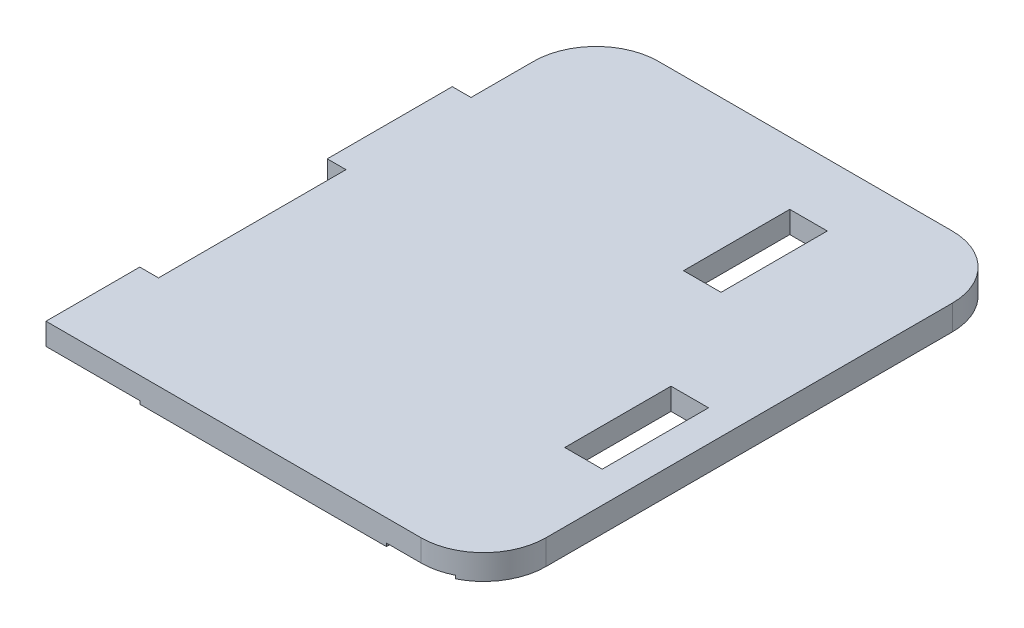
ISO-10303-21;
HEADER;
FILE_DESCRIPTION(('STEP AP214'),'2;1');
FILE_NAME('part.step','',(''),(''),'','','');
FILE_SCHEMA(('AUTOMOTIVE_DESIGN { 1 0 10303 214 1 1 1 1 }'));
ENDSEC;
DATA;
#1=APPLICATION_CONTEXT('core data for automotive mechanical design processes');
#2=APPLICATION_PROTOCOL_DEFINITION('international standard','automotive_design',2000,#1);
#3=PRODUCT_CONTEXT('',#1,'mechanical');
#4=PRODUCT('Part','Part','',(#3));
#5=PRODUCT_RELATED_PRODUCT_CATEGORY('part','',(#4));
#6=PRODUCT_DEFINITION_FORMATION('','',#4);
#7=PRODUCT_DEFINITION_CONTEXT('part definition',#1,'design');
#8=PRODUCT_DEFINITION('design','',#6,#7);
#9=PRODUCT_DEFINITION_SHAPE('','',#8);
#10=(LENGTH_UNIT() NAMED_UNIT(*) SI_UNIT(.MILLI.,.METRE.));
#11=(NAMED_UNIT(*) PLANE_ANGLE_UNIT() SI_UNIT($,.RADIAN.));
#12=(NAMED_UNIT(*) SI_UNIT($,.STERADIAN.) SOLID_ANGLE_UNIT());
#13=UNCERTAINTY_MEASURE_WITH_UNIT(LENGTH_MEASURE(1.E-05),#10,'distance_accuracy_value','');
#14=(GEOMETRIC_REPRESENTATION_CONTEXT(3) GLOBAL_UNCERTAINTY_ASSIGNED_CONTEXT((#13)) GLOBAL_UNIT_ASSIGNED_CONTEXT((#10,
#11,#12)) REPRESENTATION_CONTEXT('',''));
#15=CARTESIAN_POINT('',(0.,0.,0.));
#16=DIRECTION('',(0.,0.,1.));
#17=DIRECTION('',(1.,0.,0.));
#18=AXIS2_PLACEMENT_3D('',#15,#16,#17);
#19=CARTESIAN_POINT('',(0.,0.,0.));
#20=DIRECTION('',(0.,1.,0.));
#21=DIRECTION('',(0.,0.,1.));
#22=AXIS2_PLACEMENT_3D('',#19,#20,#21);
#23=PLANE('',#22);
#24=CARTESIAN_POINT('',(6.,0.,-1.));
#25=DIRECTION('',(0.,1.,0.));
#26=DIRECTION('',(0.,0.,1.));
#27=AXIS2_PLACEMENT_3D('',#24,#25,#26);
#28=CIRCLE('',#27,1.);
#29=CARTESIAN_POINT('',(7.,0.,-1.));
#30=VERTEX_POINT('',#29);
#31=CARTESIAN_POINT('',(6.448166537674,0.,-0.106049914978863));
#32=VERTEX_POINT('',#31);
#33=EDGE_CURVE('E468',#30,#32,#28,.F.);
#34=ORIENTED_EDGE('',*,*,#33,.T.);
#35=DIRECTION('',(0.,0.,1.));
#36=VECTOR('',#35,1.);
#37=CARTESIAN_POINT('',(6.448166537674,0.,-2.4));
#38=LINE('',#37,#36);
#39=CARTESIAN_POINT('',(6.448166537674,0.,-2.4));
#40=VERTEX_POINT('',#39);
#41=EDGE_CURVE('E494',#40,#32,#38,.T.);
#42=ORIENTED_EDGE('',*,*,#41,.F.);
#43=DIRECTION('',(1.,0.,0.));
#44=VECTOR('',#43,1.);
#45=CARTESIAN_POINT('',(5.9,0.,-2.4));
#46=LINE('',#45,#44);
#47=CARTESIAN_POINT('',(6.5,0.,-2.4));
#48=VERTEX_POINT('',#47);
#49=EDGE_CURVE('E352',#40,#48,#46,.T.);
#50=ORIENTED_EDGE('',*,*,#49,.T.);
#51=DIRECTION('',(0.,0.,-1.));
#52=VECTOR('',#51,1.);
#53=CARTESIAN_POINT('',(6.5,0.,-2.4));
#54=LINE('',#53,#52);
#55=CARTESIAN_POINT('',(6.5,0.,-4.1));
#56=VERTEX_POINT('',#55);
#57=EDGE_CURVE('E365',#48,#56,#54,.T.);
#58=ORIENTED_EDGE('',*,*,#57,.T.);
#59=DIRECTION('',(-1.,0.,0.));
#60=VECTOR('',#59,1.);
#61=CARTESIAN_POINT('',(5.9,0.,-4.1));
#62=LINE('',#61,#60);
#63=CARTESIAN_POINT('',(6.448166537674,0.,-4.1));
#64=VERTEX_POINT('',#63);
#65=EDGE_CURVE('E356',#56,#64,#62,.T.);
#66=ORIENTED_EDGE('',*,*,#65,.T.);
#67=CARTESIAN_POINT('',(6.448166537674,0.,-5.1));
#68=VERTEX_POINT('',#67);
#69=EDGE_CURVE('E552',#68,#64,#38,.T.);
#70=ORIENTED_EDGE('',*,*,#69,.F.);
#71=CARTESIAN_POINT('',(5.9,0.,-5.1));
#72=DIRECTION('',(0.,-1.,0.));
#73=DIRECTION('',(0.,0.,-1.));
#74=AXIS2_PLACEMENT_3D('',#71,#72,#73);
#75=CIRCLE('',#74,0.548166537674001);
#76=CARTESIAN_POINT('',(5.97920351117561,0.,-5.64241437743017));
#77=VERTEX_POINT('',#76);
#78=EDGE_CURVE('E549',#77,#68,#75,.T.);
#79=ORIENTED_EDGE('',*,*,#78,.F.);
#80=DIRECTION('',(0.989506546188972,0.,0.144488044658277));
#81=VECTOR('',#80,1.);
#82=CARTESIAN_POINT('',(5.97920351117561,0.,-5.64241437743017));
#83=LINE('',#82,#81);
#84=CARTESIAN_POINT('',(4.9,0.,-5.8));
#85=VERTEX_POINT('',#84);
#86=EDGE_CURVE('E546',#85,#77,#83,.T.);
#87=ORIENTED_EDGE('',*,*,#86,.F.);
#88=DIRECTION('',(1.,0.,0.));
#89=VECTOR('',#88,1.);
#90=CARTESIAN_POINT('',(4.4,0.,-5.8));
#91=LINE('',#90,#89);
#92=CARTESIAN_POINT('',(5.,0.,-5.8));
#93=VERTEX_POINT('',#92);
#94=EDGE_CURVE('E380',#85,#93,#91,.T.);
#95=ORIENTED_EDGE('',*,*,#94,.T.);
#96=DIRECTION('',(0.,0.,-1.));
#97=VECTOR('',#96,1.);
#98=CARTESIAN_POINT('',(5.,0.,-7.5));
#99=LINE('',#98,#97);
#100=CARTESIAN_POINT('',(5.,0.,-7.5));
#101=VERTEX_POINT('',#100);
#102=EDGE_CURVE('E393',#93,#101,#99,.T.);
#103=ORIENTED_EDGE('',*,*,#102,.T.);
#104=DIRECTION('',(-1.,0.,0.));
#105=VECTOR('',#104,1.);
#106=CARTESIAN_POINT('',(4.4,0.,-7.5));
#107=LINE('',#106,#105);
#108=CARTESIAN_POINT('',(4.9,0.,-7.5));
#109=VERTEX_POINT('',#108);
#110=EDGE_CURVE('E384',#101,#109,#107,.T.);
#111=ORIENTED_EDGE('',*,*,#110,.T.);
#112=DIRECTION('',(0.,0.,1.));
#113=VECTOR('',#112,1.);
#114=CARTESIAN_POINT('',(4.9,0.,-5.8));
#115=LINE('',#114,#113);
#116=CARTESIAN_POINT('',(4.9,0.,-8.5));
#117=VERTEX_POINT('',#116);
#118=EDGE_CURVE('E544',#117,#109,#115,.T.);
#119=ORIENTED_EDGE('',*,*,#118,.F.);
#120=DIRECTION('',(-1.,0.,0.));
#121=VECTOR('',#120,1.);
#122=CARTESIAN_POINT('',(7.,0.,-8.5));
#123=LINE('',#122,#121);
#124=CARTESIAN_POINT('',(6.,0.,-8.5));
#125=VERTEX_POINT('',#124);
#126=EDGE_CURVE('E412',#125,#117,#123,.T.);
#127=ORIENTED_EDGE('',*,*,#126,.F.);
#128=CARTESIAN_POINT('',(6.,0.,-7.5));
#129=DIRECTION('',(0.,1.,0.));
#130=DIRECTION('',(0.,0.,1.));
#131=AXIS2_PLACEMENT_3D('',#128,#129,#130);
#132=CIRCLE('',#131,1.);
#133=CARTESIAN_POINT('',(7.,0.,-7.5));
#134=VERTEX_POINT('',#133);
#135=EDGE_CURVE('E466',#125,#134,#132,.F.);
#136=ORIENTED_EDGE('',*,*,#135,.T.);
#137=DIRECTION('',(0.,0.,-1.));
#138=VECTOR('',#137,1.);
#139=CARTESIAN_POINT('',(7.,0.,0.));
#140=LINE('',#139,#138);
#141=EDGE_CURVE('E435',#30,#134,#140,.T.);
#142=ORIENTED_EDGE('',*,*,#141,.F.);
#143=EDGE_LOOP('',(#34,#42,#50,#58,#66,#70,#79,#87,#95,#103,#111,#119,#127,#136,#142));
#144=FACE_BOUND('',#143,.T.);
#145=ADVANCED_FACE('F35',(#144),#23,.F.);
#146=CARTESIAN_POINT('',(0.,0.4,-1.5));
#147=DIRECTION('',(1.,0.,0.));
#148=DIRECTION('',(0.,0.,-1.));
#149=AXIS2_PLACEMENT_3D('',#146,#147,#148);
#150=PLANE('',#149);
#151=DIRECTION('',(0.,0.,-1.));
#152=VECTOR('',#151,1.);
#153=CARTESIAN_POINT('',(0.,0.05,-8.5));
#154=LINE('',#153,#152);
#155=CARTESIAN_POINT('',(0.,0.05,0.));
#156=VERTEX_POINT('',#155);
#157=CARTESIAN_POINT('',(0.,0.05,-1.5));
#158=VERTEX_POINT('',#157);
#159=EDGE_CURVE('E308',#156,#158,#154,.T.);
#160=ORIENTED_EDGE('',*,*,#159,.F.);
#161=DIRECTION('',(0.,-1.,0.));
#162=VECTOR('',#161,1.);
#163=CARTESIAN_POINT('',(0.,0.4,0.));
#164=LINE('',#163,#162);
#165=CARTESIAN_POINT('',(0.,0.4,0.));
#166=VERTEX_POINT('',#165);
#167=EDGE_CURVE('E458',#166,#156,#164,.T.);
#168=ORIENTED_EDGE('',*,*,#167,.F.);
#169=DIRECTION('',(0.,0.,1.));
#170=VECTOR('',#169,1.);
#171=CARTESIAN_POINT('',(0.,0.4,-1.5));
#172=LINE('',#171,#170);
#173=CARTESIAN_POINT('',(0.,0.4,-1.5));
#174=VERTEX_POINT('',#173);
#175=EDGE_CURVE('E408',#174,#166,#172,.T.);
#176=ORIENTED_EDGE('',*,*,#175,.F.);
#177=DIRECTION('',(0.,-1.,0.));
#178=VECTOR('',#177,1.);
#179=CARTESIAN_POINT('',(0.,0.4,-1.5));
#180=LINE('',#179,#178);
#181=EDGE_CURVE('E433',#174,#158,#180,.T.);
#182=ORIENTED_EDGE('',*,*,#181,.T.);
#183=EDGE_LOOP('',(#160,#168,#176,#182));
#184=FACE_BOUND('',#183,.T.);
#185=ADVANCED_FACE('F509',(#184),#150,.F.);
#186=CARTESIAN_POINT('',(0.299999999999999,0.4,-8.5));
#187=DIRECTION('',(1.,0.,0.));
#188=DIRECTION('',(0.,0.,-1.));
#189=AXIS2_PLACEMENT_3D('',#186,#187,#188);
#190=PLANE('',#189);
#191=DIRECTION('',(0.,0.,-1.));
#192=VECTOR('',#191,1.);
#193=CARTESIAN_POINT('',(0.299999999999999,0.05,-8.5));
#194=LINE('',#193,#192);
#195=CARTESIAN_POINT('',(0.299999999999999,0.05,-6.5));
#196=VERTEX_POINT('',#195);
#197=CARTESIAN_POINT('',(0.299999999999999,0.05,-7.5));
#198=VERTEX_POINT('',#197);
#199=EDGE_CURVE('E58',#196,#198,#194,.T.);
#200=ORIENTED_EDGE('',*,*,#199,.F.);
#201=DIRECTION('',(0.,-1.,0.));
#202=VECTOR('',#201,1.);
#203=CARTESIAN_POINT('',(0.299999999999999,0.4,-6.5));
#204=LINE('',#203,#202);
#205=CARTESIAN_POINT('',(0.299999999999999,0.4,-6.5));
#206=VERTEX_POINT('',#205);
#207=EDGE_CURVE('E455',#206,#196,#204,.T.);
#208=ORIENTED_EDGE('',*,*,#207,.F.);
#209=DIRECTION('',(0.,0.,1.));
#210=VECTOR('',#209,1.);
#211=CARTESIAN_POINT('',(0.299999999999999,0.4,-8.5));
#212=LINE('',#211,#210);
#213=CARTESIAN_POINT('',(0.299999999999999,0.4,-7.5));
#214=VERTEX_POINT('',#213);
#215=EDGE_CURVE('E421',#214,#206,#212,.T.);
#216=ORIENTED_EDGE('',*,*,#215,.F.);
#217=DIRECTION('',(0.,-1.,0.));
#218=VECTOR('',#217,1.);
#219=CARTESIAN_POINT('',(0.299999999999999,0.4,-7.5));
#220=LINE('',#219,#218);
#221=EDGE_CURVE('E484',#214,#198,#220,.T.);
#222=ORIENTED_EDGE('',*,*,#221,.T.);
#223=EDGE_LOOP('',(#200,#208,#216,#222));
#224=FACE_BOUND('',#223,.T.);
#225=ADVANCED_FACE('F661',(#224),#190,.F.);
#226=CARTESIAN_POINT('',(0.299999999999999,0.4,-6.5));
#227=DIRECTION('',(0.,0.,1.));
#228=DIRECTION('',(1.,0.,0.));
#229=AXIS2_PLACEMENT_3D('',#226,#227,#228);
#230=PLANE('',#229);
#231=DIRECTION('',(1.,0.,0.));
#232=VECTOR('',#231,1.);
#233=CARTESIAN_POINT('',(0.299999999999999,0.05,-6.5));
#234=LINE('',#233,#232);
#235=CARTESIAN_POINT('',(0.,0.05,-6.5));
#236=VERTEX_POINT('',#235);
#237=EDGE_CURVE('E319',#236,#196,#234,.T.);
#238=ORIENTED_EDGE('',*,*,#237,.F.);
#239=DIRECTION('',(0.,-1.,0.));
#240=VECTOR('',#239,1.);
#241=CARTESIAN_POINT('',(0.,0.4,-6.5));
#242=LINE('',#241,#240);
#243=CARTESIAN_POINT('',(0.,0.4,-6.5));
#244=VERTEX_POINT('',#243);
#245=EDGE_CURVE('E452',#244,#236,#242,.T.);
#246=ORIENTED_EDGE('',*,*,#245,.F.);
#247=DIRECTION('',(-1.,0.,0.));
#248=VECTOR('',#247,1.);
#249=CARTESIAN_POINT('',(0.299999999999999,0.4,-6.5));
#250=LINE('',#249,#248);
#251=EDGE_CURVE('E423',#206,#244,#250,.T.);
#252=ORIENTED_EDGE('',*,*,#251,.F.);
#253=ORIENTED_EDGE('',*,*,#207,.T.);
#254=EDGE_LOOP('',(#238,#246,#252,#253));
#255=FACE_BOUND('',#254,.T.);
#256=ADVANCED_FACE('F698',(#255),#230,.F.);
#257=CARTESIAN_POINT('',(0.,0.4,-6.5));
#258=DIRECTION('',(1.,0.,0.));
#259=DIRECTION('',(0.,0.,-1.));
#260=AXIS2_PLACEMENT_3D('',#257,#258,#259);
#261=PLANE('',#260);
#262=CARTESIAN_POINT('',(0.,0.05,-4.5));
#263=VERTEX_POINT('',#262);
#264=EDGE_CURVE('E307',#263,#236,#154,.T.);
#265=ORIENTED_EDGE('',*,*,#264,.F.);
#266=DIRECTION('',(0.,-1.,0.));
#267=VECTOR('',#266,1.);
#268=CARTESIAN_POINT('',(0.,0.4,-4.5));
#269=LINE('',#268,#267);
#270=CARTESIAN_POINT('',(0.,0.4,-4.5));
#271=VERTEX_POINT('',#270);
#272=EDGE_CURVE('E449',#271,#263,#269,.T.);
#273=ORIENTED_EDGE('',*,*,#272,.F.);
#274=DIRECTION('',(0.,0.,1.));
#275=VECTOR('',#274,1.);
#276=CARTESIAN_POINT('',(0.,0.4,-6.5));
#277=LINE('',#276,#275);
#278=EDGE_CURVE('E425',#244,#271,#277,.T.);
#279=ORIENTED_EDGE('',*,*,#278,.F.);
#280=ORIENTED_EDGE('',*,*,#245,.T.);
#281=EDGE_LOOP('',(#265,#273,#279,#280));
#282=FACE_BOUND('',#281,.T.);
#283=ADVANCED_FACE('F694',(#282),#261,.F.);
#284=CARTESIAN_POINT('',(0.,0.4,-4.5));
#285=DIRECTION('',(0.,0.,-1.));
#286=DIRECTION('',(-1.,0.,0.));
#287=AXIS2_PLACEMENT_3D('',#284,#285,#286);
#288=PLANE('',#287);
#289=DIRECTION('',(-1.,0.,0.));
#290=VECTOR('',#289,1.);
#291=CARTESIAN_POINT('',(0.,0.05,-4.5));
#292=LINE('',#291,#290);
#293=CARTESIAN_POINT('',(0.3,0.05,-4.5));
#294=VERTEX_POINT('',#293);
#295=EDGE_CURVE('E326',#294,#263,#292,.T.);
#296=ORIENTED_EDGE('',*,*,#295,.F.);
#297=DIRECTION('',(0.,-1.,0.));
#298=VECTOR('',#297,1.);
#299=CARTESIAN_POINT('',(0.3,0.4,-4.5));
#300=LINE('',#299,#298);
#301=CARTESIAN_POINT('',(0.3,0.4,-4.5));
#302=VERTEX_POINT('',#301);
#303=EDGE_CURVE('E446',#302,#294,#300,.T.);
#304=ORIENTED_EDGE('',*,*,#303,.F.);
#305=DIRECTION('',(1.,0.,0.));
#306=VECTOR('',#305,1.);
#307=CARTESIAN_POINT('',(0.,0.4,-4.5));
#308=LINE('',#307,#306);
#309=EDGE_CURVE('E427',#271,#302,#308,.T.);
#310=ORIENTED_EDGE('',*,*,#309,.F.);
#311=ORIENTED_EDGE('',*,*,#272,.T.);
#312=EDGE_LOOP('',(#296,#304,#310,#311));
#313=FACE_BOUND('',#312,.T.);
#314=ADVANCED_FACE('F688',(#313),#288,.F.);
#315=CARTESIAN_POINT('',(0.3,0.4,-4.5));
#316=DIRECTION('',(1.,0.,0.));
#317=DIRECTION('',(0.,0.,-1.));
#318=AXIS2_PLACEMENT_3D('',#315,#316,#317);
#319=PLANE('',#318);
#320=DIRECTION('',(0.,0.,-1.));
#321=VECTOR('',#320,1.);
#322=CARTESIAN_POINT('',(0.3,0.05,-4.5));
#323=LINE('',#322,#321);
#324=CARTESIAN_POINT('',(0.3,0.05,-1.5));
#325=VERTEX_POINT('',#324);
#326=EDGE_CURVE('E324',#325,#294,#323,.T.);
#327=ORIENTED_EDGE('',*,*,#326,.F.);
#328=DIRECTION('',(0.,-1.,0.));
#329=VECTOR('',#328,1.);
#330=CARTESIAN_POINT('',(0.3,0.4,-1.5));
#331=LINE('',#330,#329);
#332=CARTESIAN_POINT('',(0.3,0.4,-1.5));
#333=VERTEX_POINT('',#332);
#334=EDGE_CURVE('E443',#333,#325,#331,.T.);
#335=ORIENTED_EDGE('',*,*,#334,.F.);
#336=DIRECTION('',(0.,0.,1.));
#337=VECTOR('',#336,1.);
#338=CARTESIAN_POINT('',(0.3,0.4,-4.5));
#339=LINE('',#338,#337);
#340=EDGE_CURVE('E429',#302,#333,#339,.T.);
#341=ORIENTED_EDGE('',*,*,#340,.F.);
#342=ORIENTED_EDGE('',*,*,#303,.T.);
#343=EDGE_LOOP('',(#327,#335,#341,#342));
#344=FACE_BOUND('',#343,.T.);
#345=ADVANCED_FACE('F683',(#344),#319,.F.);
#346=CARTESIAN_POINT('',(0.3,0.4,-1.5));
#347=DIRECTION('',(0.,0.,1.));
#348=DIRECTION('',(1.,0.,0.));
#349=AXIS2_PLACEMENT_3D('',#346,#347,#348);
#350=PLANE('',#349);
#351=DIRECTION('',(1.,0.,0.));
#352=VECTOR('',#351,1.);
#353=CARTESIAN_POINT('',(0.3,0.05,-1.5));
#354=LINE('',#353,#352);
#355=EDGE_CURVE('E322',#158,#325,#354,.T.);
#356=ORIENTED_EDGE('',*,*,#355,.F.);
#357=ORIENTED_EDGE('',*,*,#181,.F.);
#358=DIRECTION('',(-1.,0.,0.));
#359=VECTOR('',#358,1.);
#360=CARTESIAN_POINT('',(0.3,0.4,-1.5));
#361=LINE('',#360,#359);
#362=EDGE_CURVE('E431',#333,#174,#361,.T.);
#363=ORIENTED_EDGE('',*,*,#362,.F.);
#364=ORIENTED_EDGE('',*,*,#334,.T.);
#365=EDGE_LOOP('',(#356,#357,#363,#364));
#366=FACE_BOUND('',#365,.T.);
#367=ADVANCED_FACE('F677',(#366),#350,.F.);
#368=CARTESIAN_POINT('',(4.4,0.4,-7.5));
#369=DIRECTION('',(1.,0.,0.));
#370=DIRECTION('',(0.,0.,-1.));
#371=AXIS2_PLACEMENT_3D('',#368,#369,#370);
#372=PLANE('',#371);
#373=DIRECTION('',(0.,-1.,0.));
#374=VECTOR('',#373,1.);
#375=CARTESIAN_POINT('',(4.4,0.4,-5.8));
#376=LINE('',#375,#374);
#377=CARTESIAN_POINT('',(4.4,0.4,-5.8));
#378=VERTEX_POINT('',#377);
#379=CARTESIAN_POINT('',(4.4,0.05,-5.8));
#380=VERTEX_POINT('',#379);
#381=EDGE_CURVE('E405',#378,#380,#376,.T.);
#382=ORIENTED_EDGE('',*,*,#381,.T.);
#383=DIRECTION('',(0.,0.,-1.));
#384=VECTOR('',#383,1.);
#385=CARTESIAN_POINT('',(4.4,0.05,-7.5));
#386=LINE('',#385,#384);
#387=CARTESIAN_POINT('',(4.4,0.05,-7.5));
#388=VERTEX_POINT('',#387);
#389=EDGE_CURVE('E340',#380,#388,#386,.T.);
#390=ORIENTED_EDGE('',*,*,#389,.T.);
#391=DIRECTION('',(0.,-1.,0.));
#392=VECTOR('',#391,1.);
#393=CARTESIAN_POINT('',(4.4,0.4,-7.5));
#394=LINE('',#393,#392);
#395=CARTESIAN_POINT('',(4.4,0.4,-7.5));
#396=VERTEX_POINT('',#395);
#397=EDGE_CURVE('E391',#396,#388,#394,.T.);
#398=ORIENTED_EDGE('',*,*,#397,.F.);
#399=DIRECTION('',(0.,0.,1.));
#400=VECTOR('',#399,1.);
#401=CARTESIAN_POINT('',(4.4,0.4,-7.5));
#402=LINE('',#401,#400);
#403=EDGE_CURVE('E381',#396,#378,#402,.T.);
#404=ORIENTED_EDGE('',*,*,#403,.T.);
#405=EDGE_LOOP('',(#382,#390,#398,#404));
#406=FACE_BOUND('',#405,.T.);
#407=ADVANCED_FACE('F641',(#406),#372,.T.);
#408=CARTESIAN_POINT('',(5.9,0.4,-2.4));
#409=DIRECTION('',(1.,0.,0.));
#410=DIRECTION('',(0.,0.,-1.));
#411=AXIS2_PLACEMENT_3D('',#408,#409,#410);
#412=PLANE('',#411);
#413=DIRECTION('',(0.,-1.,0.));
#414=VECTOR('',#413,1.);
#415=CARTESIAN_POINT('',(5.9,0.4,-2.4));
#416=LINE('',#415,#414);
#417=CARTESIAN_POINT('',(5.9,0.4,-2.4));
#418=VERTEX_POINT('',#417);
#419=CARTESIAN_POINT('',(5.9,0.05,-2.4));
#420=VERTEX_POINT('',#419);
#421=EDGE_CURVE('E377',#418,#420,#416,.T.);
#422=ORIENTED_EDGE('',*,*,#421,.T.);
#423=DIRECTION('',(0.,0.,-1.));
#424=VECTOR('',#423,1.);
#425=CARTESIAN_POINT('',(5.9,0.05,-2.4));
#426=LINE('',#425,#424);
#427=CARTESIAN_POINT('',(5.9,0.05,-4.1));
#428=VERTEX_POINT('',#427);
#429=EDGE_CURVE('E331',#420,#428,#426,.T.);
#430=ORIENTED_EDGE('',*,*,#429,.T.);
#431=DIRECTION('',(0.,-1.,0.));
#432=VECTOR('',#431,1.);
#433=CARTESIAN_POINT('',(5.9,0.4,-4.1));
#434=LINE('',#433,#432);
#435=CARTESIAN_POINT('',(5.9,0.4,-4.1));
#436=VERTEX_POINT('',#435);
#437=EDGE_CURVE('E363',#436,#428,#434,.T.);
#438=ORIENTED_EDGE('',*,*,#437,.F.);
#439=DIRECTION('',(0.,0.,1.));
#440=VECTOR('',#439,1.);
#441=CARTESIAN_POINT('',(5.9,0.4,-2.4));
#442=LINE('',#441,#440);
#443=EDGE_CURVE('E353',#436,#418,#442,.T.);
#444=ORIENTED_EDGE('',*,*,#443,.T.);
#445=EDGE_LOOP('',(#422,#430,#438,#444));
#446=FACE_BOUND('',#445,.T.);
#447=ADVANCED_FACE('F608',(#446),#412,.T.);
#448=CARTESIAN_POINT('',(1.3,0.4,-7.5));
#449=DIRECTION('',(0.,-1.,0.));
#450=DIRECTION('',(0.,0.,-1.));
#451=AXIS2_PLACEMENT_3D('',#448,#449,#450);
#452=CYLINDRICAL_SURFACE('',#451,1.);
#453=DIRECTION('',(0.,-1.,0.));
#454=VECTOR('',#453,1.);
#455=CARTESIAN_POINT('',(1.3,0.4,-8.5));
#456=LINE('',#455,#454);
#457=CARTESIAN_POINT('',(1.3,0.05,-8.5));
#458=VERTEX_POINT('',#457);
#459=CARTESIAN_POINT('',(1.3,0.4,-8.5));
#460=VERTEX_POINT('',#459);
#461=EDGE_CURVE('E479',#458,#460,#456,.F.);
#462=ORIENTED_EDGE('',*,*,#461,.F.);
#463=CARTESIAN_POINT('',(1.3,0.05,-7.5));
#464=DIRECTION('',(0.,-1.,0.));
#465=DIRECTION('',(0.,0.,-1.));
#466=AXIS2_PLACEMENT_3D('',#463,#464,#465);
#467=CIRCLE('',#466,1.);
#468=EDGE_CURVE('E487',#458,#198,#467,.F.);
#469=ORIENTED_EDGE('',*,*,#468,.T.);
#470=ORIENTED_EDGE('',*,*,#221,.F.);
#471=CARTESIAN_POINT('',(1.3,0.4,-7.5));
#472=DIRECTION('',(0.,1.,0.));
#473=DIRECTION('',(0.,0.,1.));
#474=AXIS2_PLACEMENT_3D('',#471,#472,#473);
#475=CIRCLE('',#474,1.);
#476=EDGE_CURVE('E473',#460,#214,#475,.T.);
#477=ORIENTED_EDGE('',*,*,#476,.F.);
#478=EDGE_LOOP('',(#462,#469,#470,#477));
#479=FACE_BOUND('',#478,.T.);
#480=ADVANCED_FACE('F37',(#479),#452,.T.);
#481=CARTESIAN_POINT('',(0.,0.4,0.));
#482=DIRECTION('',(0.,1.,0.));
#483=DIRECTION('',(0.,0.,1.));
#484=AXIS2_PLACEMENT_3D('',#481,#482,#483);
#485=PLANE('',#484);
#486=DIRECTION('',(1.,0.,0.));
#487=VECTOR('',#486,1.);
#488=CARTESIAN_POINT('',(0.,0.4,0.));
#489=LINE('',#488,#487);
#490=CARTESIAN_POINT('',(6.,0.4,0.));
#491=VERTEX_POINT('',#490);
#492=EDGE_CURVE('E411',#166,#491,#489,.T.);
#493=ORIENTED_EDGE('',*,*,#492,.T.);
#494=CARTESIAN_POINT('',(6.,0.4,-1.));
#495=DIRECTION('',(0.,1.,0.));
#496=DIRECTION('',(0.,0.,1.));
#497=AXIS2_PLACEMENT_3D('',#494,#495,#496);
#498=CIRCLE('',#497,1.);
#499=CARTESIAN_POINT('',(7.,0.4,-1.));
#500=VERTEX_POINT('',#499);
#501=EDGE_CURVE('E477',#491,#500,#498,.T.);
#502=ORIENTED_EDGE('',*,*,#501,.T.);
#503=DIRECTION('',(0.,0.,-1.));
#504=VECTOR('',#503,1.);
#505=CARTESIAN_POINT('',(7.,0.4,0.));
#506=LINE('',#505,#504);
#507=CARTESIAN_POINT('',(7.,0.4,-7.5));
#508=VERTEX_POINT('',#507);
#509=EDGE_CURVE('E415',#500,#508,#506,.T.);
#510=ORIENTED_EDGE('',*,*,#509,.T.);
#511=CARTESIAN_POINT('',(6.,0.4,-7.5));
#512=DIRECTION('',(0.,1.,0.));
#513=DIRECTION('',(0.,0.,1.));
#514=AXIS2_PLACEMENT_3D('',#511,#512,#513);
#515=CIRCLE('',#514,1.);
#516=CARTESIAN_POINT('',(6.,0.4,-8.5));
#517=VERTEX_POINT('',#516);
#518=EDGE_CURVE('E475',#508,#517,#515,.T.);
#519=ORIENTED_EDGE('',*,*,#518,.T.);
#520=DIRECTION('',(-1.,0.,0.));
#521=VECTOR('',#520,1.);
#522=CARTESIAN_POINT('',(7.,0.4,-8.5));
#523=LINE('',#522,#521);
#524=EDGE_CURVE('E418',#517,#460,#523,.T.);
#525=ORIENTED_EDGE('',*,*,#524,.T.);
#526=ORIENTED_EDGE('',*,*,#476,.T.);
#527=ORIENTED_EDGE('',*,*,#215,.T.);
#528=ORIENTED_EDGE('',*,*,#251,.T.);
#529=ORIENTED_EDGE('',*,*,#278,.T.);
#530=ORIENTED_EDGE('',*,*,#309,.T.);
#531=ORIENTED_EDGE('',*,*,#340,.T.);
#532=ORIENTED_EDGE('',*,*,#362,.T.);
#533=ORIENTED_EDGE('',*,*,#175,.T.);
#534=EDGE_LOOP('',(#493,#502,#510,#519,#525,#526,#527,#528,#529,#530,#531,#532,#533));
#535=FACE_BOUND('',#534,.T.);
#536=DIRECTION('',(1.,0.,0.));
#537=VECTOR('',#536,1.);
#538=CARTESIAN_POINT('',(4.4,0.4,-5.8));
#539=LINE('',#538,#537);
#540=CARTESIAN_POINT('',(5.,0.4,-5.8));
#541=VERTEX_POINT('',#540);
#542=EDGE_CURVE('E383',#378,#541,#539,.T.);
#543=ORIENTED_EDGE('',*,*,#542,.F.);
#544=ORIENTED_EDGE('',*,*,#403,.F.);
#545=DIRECTION('',(-1.,0.,0.));
#546=VECTOR('',#545,1.);
#547=CARTESIAN_POINT('',(4.4,0.4,-7.5));
#548=LINE('',#547,#546);
#549=CARTESIAN_POINT('',(5.,0.4,-7.5));
#550=VERTEX_POINT('',#549);
#551=EDGE_CURVE('E389',#550,#396,#548,.T.);
#552=ORIENTED_EDGE('',*,*,#551,.F.);
#553=DIRECTION('',(0.,0.,-1.));
#554=VECTOR('',#553,1.);
#555=CARTESIAN_POINT('',(5.,0.4,-7.5));
#556=LINE('',#555,#554);
#557=EDGE_CURVE('E386',#541,#550,#556,.T.);
#558=ORIENTED_EDGE('',*,*,#557,.F.);
#559=EDGE_LOOP('',(#543,#544,#552,#558));
#560=FACE_BOUND('',#559,.T.);
#561=DIRECTION('',(1.,0.,0.));
#562=VECTOR('',#561,1.);
#563=CARTESIAN_POINT('',(5.9,0.4,-2.4));
#564=LINE('',#563,#562);
#565=CARTESIAN_POINT('',(6.5,0.4,-2.4));
#566=VERTEX_POINT('',#565);
#567=EDGE_CURVE('E355',#418,#566,#564,.T.);
#568=ORIENTED_EDGE('',*,*,#567,.F.);
#569=ORIENTED_EDGE('',*,*,#443,.F.);
#570=DIRECTION('',(-1.,0.,0.));
#571=VECTOR('',#570,1.);
#572=CARTESIAN_POINT('',(5.9,0.4,-4.1));
#573=LINE('',#572,#571);
#574=CARTESIAN_POINT('',(6.5,0.4,-4.1));
#575=VERTEX_POINT('',#574);
#576=EDGE_CURVE('E361',#575,#436,#573,.T.);
#577=ORIENTED_EDGE('',*,*,#576,.F.);
#578=DIRECTION('',(0.,0.,-1.));
#579=VECTOR('',#578,1.);
#580=CARTESIAN_POINT('',(6.5,0.4,-2.4));
#581=LINE('',#580,#579);
#582=EDGE_CURVE('E358',#566,#575,#581,.T.);
#583=ORIENTED_EDGE('',*,*,#582,.F.);
#584=EDGE_LOOP('',(#568,#569,#577,#583));
#585=FACE_BOUND('',#584,.T.);
#586=ADVANCED_FACE('F500',(#535,#560,#585),#485,.T.);
#587=CARTESIAN_POINT('',(3.9,0.,-8.5));
#588=VERTEX_POINT('',#587);
#589=CARTESIAN_POINT('',(1.5,0.,-8.5));
#590=VERTEX_POINT('',#589);
#591=EDGE_CURVE('E438',#588,#590,#123,.T.);
#592=ORIENTED_EDGE('',*,*,#591,.F.);
#593=DIRECTION('',(0.,0.,-1.));
#594=VECTOR('',#593,1.);
#595=CARTESIAN_POINT('',(3.9,0.,-5.8));
#596=LINE('',#595,#594);
#597=CARTESIAN_POINT('',(3.9,0.,-5.36770778392691));
#598=VERTEX_POINT('',#597);
#599=EDGE_CURVE('E532',#598,#588,#596,.T.);
#600=ORIENTED_EDGE('',*,*,#599,.F.);
#601=CARTESIAN_POINT('',(4.4,0.,-5.36770778392691));
#602=DIRECTION('',(0.,-1.,0.));
#603=DIRECTION('',(0.,0.,-1.));
#604=AXIS2_PLACEMENT_3D('',#601,#602,#603);
#605=CIRCLE('',#604,0.500000000000001);
#606=CARTESIAN_POINT('',(4.32775597767086,0.,-4.87295451083242));
#607=VERTEX_POINT('',#606);
#608=EDGE_CURVE('E537',#607,#598,#605,.T.);
#609=ORIENTED_EDGE('',*,*,#608,.F.);
#610=DIRECTION('',(-0.989506546188972,0.,-0.144488044658277));
#611=VECTOR('',#610,1.);
#612=CARTESIAN_POINT('',(5.448166537674,0.,-4.70935182255023));
#613=LINE('',#612,#611);
#614=CARTESIAN_POINT('',(5.448166537674,0.,-4.70935182255023));
#615=VERTEX_POINT('',#614);
#616=EDGE_CURVE('E535',#615,#607,#613,.T.);
#617=ORIENTED_EDGE('',*,*,#616,.F.);
#618=DIRECTION('',(0.,0.,-1.));
#619=VECTOR('',#618,1.);
#620=CARTESIAN_POINT('',(5.448166537674,0.,-2.4));
#621=LINE('',#620,#619);
#622=CARTESIAN_POINT('',(5.448166537674,0.,0.));
#623=VERTEX_POINT('',#622);
#624=EDGE_CURVE('E316',#623,#615,#621,.T.);
#625=ORIENTED_EDGE('',*,*,#624,.F.);
#626=DIRECTION('',(1.,0.,0.));
#627=VECTOR('',#626,1.);
#628=CARTESIAN_POINT('',(0.,0.,0.));
#629=LINE('',#628,#627);
#630=CARTESIAN_POINT('',(1.5,0.,0.));
#631=VERTEX_POINT('',#630);
#632=EDGE_CURVE('E291',#631,#623,#629,.T.);
#633=ORIENTED_EDGE('',*,*,#632,.F.);
#634=DIRECTION('',(0.,0.,1.));
#635=VECTOR('',#634,1.);
#636=CARTESIAN_POINT('',(1.5,0.,-8.5));
#637=LINE('',#636,#635);
#638=EDGE_CURVE('E305',#590,#631,#637,.T.);
#639=ORIENTED_EDGE('',*,*,#638,.F.);
#640=EDGE_LOOP('',(#592,#600,#609,#617,#625,#633,#639));
#641=FACE_BOUND('',#640,.T.);
#642=ADVANCED_FACE('F530',(#641),#23,.F.);
#643=CARTESIAN_POINT('',(0.,0.4,0.));
#644=DIRECTION('',(0.,0.,-1.));
#645=DIRECTION('',(-1.,0.,0.));
#646=AXIS2_PLACEMENT_3D('',#643,#644,#645);
#647=PLANE('',#646);
#648=ORIENTED_EDGE('',*,*,#632,.T.);
#649=DIRECTION('',(0.,-1.,0.));
#650=VECTOR('',#649,1.);
#651=CARTESIAN_POINT('',(5.448166537674,0.05,0.));
#652=LINE('',#651,#650);
#653=CARTESIAN_POINT('',(5.448166537674,0.05,0.));
#654=VERTEX_POINT('',#653);
#655=EDGE_CURVE('E281',#654,#623,#652,.T.);
#656=ORIENTED_EDGE('',*,*,#655,.F.);
#657=DIRECTION('',(-1.,0.,0.));
#658=VECTOR('',#657,1.);
#659=CARTESIAN_POINT('',(6.448166537674,0.05,0.));
#660=LINE('',#659,#658);
#661=CARTESIAN_POINT('',(6.,0.05,0.));
#662=VERTEX_POINT('',#661);
#663=EDGE_CURVE('E265',#662,#654,#660,.T.);
#664=ORIENTED_EDGE('',*,*,#663,.F.);
#665=DIRECTION('',(0.,-1.,0.));
#666=VECTOR('',#665,1.);
#667=CARTESIAN_POINT('',(6.,0.4,0.));
#668=LINE('',#667,#666);
#669=EDGE_CURVE('E471',#662,#491,#668,.F.);
#670=ORIENTED_EDGE('',*,*,#669,.T.);
#671=ORIENTED_EDGE('',*,*,#492,.F.);
#672=ORIENTED_EDGE('',*,*,#167,.T.);
#673=DIRECTION('',(-1.,0.,0.));
#674=VECTOR('',#673,1.);
#675=CARTESIAN_POINT('',(1.5,0.05,0.));
#676=LINE('',#675,#674);
#677=CARTESIAN_POINT('',(1.5,0.05,0.));
#678=VERTEX_POINT('',#677);
#679=EDGE_CURVE('E304',#678,#156,#676,.T.);
#680=ORIENTED_EDGE('',*,*,#679,.F.);
#681=DIRECTION('',(0.,-1.,0.));
#682=VECTOR('',#681,1.);
#683=CARTESIAN_POINT('',(1.5,0.05,0.));
#684=LINE('',#683,#682);
#685=EDGE_CURVE('E312',#678,#631,#684,.T.);
#686=ORIENTED_EDGE('',*,*,#685,.T.);
#687=EDGE_LOOP('',(#648,#656,#664,#670,#671,#672,#680,#686));
#688=FACE_BOUND('',#687,.T.);
#689=ADVANCED_FACE('F288',(#688),#647,.F.);
#690=CARTESIAN_POINT('',(7.,0.4,0.));
#691=DIRECTION('',(-1.,0.,0.));
#692=DIRECTION('',(0.,0.,1.));
#693=AXIS2_PLACEMENT_3D('',#690,#691,#692);
#694=PLANE('',#693);
#695=ORIENTED_EDGE('',*,*,#509,.F.);
#696=DIRECTION('',(0.,-1.,0.));
#697=VECTOR('',#696,1.);
#698=CARTESIAN_POINT('',(7.,0.4,-1.));
#699=LINE('',#698,#697);
#700=EDGE_CURVE('E463',#500,#30,#699,.T.);
#701=ORIENTED_EDGE('',*,*,#700,.T.);
#702=ORIENTED_EDGE('',*,*,#141,.T.);
#703=DIRECTION('',(0.,-1.,0.));
#704=VECTOR('',#703,1.);
#705=CARTESIAN_POINT('',(7.,0.4,-7.5));
#706=LINE('',#705,#704);
#707=EDGE_CURVE('E461',#134,#508,#706,.F.);
#708=ORIENTED_EDGE('',*,*,#707,.T.);
#709=EDGE_LOOP('',(#695,#701,#702,#708));
#710=FACE_BOUND('',#709,.T.);
#711=ADVANCED_FACE('F622',(#710),#694,.F.);
#712=CARTESIAN_POINT('',(7.,0.4,-8.5));
#713=DIRECTION('',(0.,0.,1.));
#714=DIRECTION('',(1.,0.,0.));
#715=AXIS2_PLACEMENT_3D('',#712,#713,#714);
#716=PLANE('',#715);
#717=ORIENTED_EDGE('',*,*,#126,.T.);
#718=DIRECTION('',(0.,-1.,0.));
#719=VECTOR('',#718,1.);
#720=CARTESIAN_POINT('',(4.9,0.05,-8.5));
#721=LINE('',#720,#719);
#722=CARTESIAN_POINT('',(4.9,0.05,-8.5));
#723=VERTEX_POINT('',#722);
#724=EDGE_CURVE('E559',#723,#117,#721,.T.);
#725=ORIENTED_EDGE('',*,*,#724,.F.);
#726=DIRECTION('',(1.,0.,0.));
#727=VECTOR('',#726,1.);
#728=CARTESIAN_POINT('',(7.,0.05,-8.5));
#729=LINE('',#728,#727);
#730=CARTESIAN_POINT('',(3.9,0.05,-8.5));
#731=VERTEX_POINT('',#730);
#732=EDGE_CURVE('E346',#731,#723,#729,.T.);
#733=ORIENTED_EDGE('',*,*,#732,.F.);
#734=DIRECTION('',(0.,-1.,0.));
#735=VECTOR('',#734,1.);
#736=CARTESIAN_POINT('',(3.9,0.05,-8.5));
#737=LINE('',#736,#735);
#738=EDGE_CURVE('E527',#731,#588,#737,.T.);
#739=ORIENTED_EDGE('',*,*,#738,.T.);
#740=ORIENTED_EDGE('',*,*,#591,.T.);
#741=DIRECTION('',(0.,-1.,0.));
#742=VECTOR('',#741,1.);
#743=CARTESIAN_POINT('',(1.5,0.05,-8.5));
#744=LINE('',#743,#742);
#745=CARTESIAN_POINT('',(1.5,0.05,-8.5));
#746=VERTEX_POINT('',#745);
#747=EDGE_CURVE('E314',#746,#590,#744,.T.);
#748=ORIENTED_EDGE('',*,*,#747,.F.);
#749=DIRECTION('',(1.,0.,0.));
#750=VECTOR('',#749,1.);
#751=CARTESIAN_POINT('',(1.5,0.05,-8.5));
#752=LINE('',#751,#750);
#753=EDGE_CURVE('E310',#458,#746,#752,.T.);
#754=ORIENTED_EDGE('',*,*,#753,.F.);
#755=ORIENTED_EDGE('',*,*,#461,.T.);
#756=ORIENTED_EDGE('',*,*,#524,.F.);
#757=DIRECTION('',(0.,-1.,0.));
#758=VECTOR('',#757,1.);
#759=CARTESIAN_POINT('',(6.,0.4,-8.5));
#760=LINE('',#759,#758);
#761=EDGE_CURVE('E481',#517,#125,#760,.T.);
#762=ORIENTED_EDGE('',*,*,#761,.T.);
#763=EDGE_LOOP('',(#717,#725,#733,#739,#740,#748,#754,#755,#756,#762));
#764=FACE_BOUND('',#763,.T.);
#765=ADVANCED_FACE('F521',(#764),#716,.F.);
#766=CARTESIAN_POINT('',(4.4,0.4,-5.8));
#767=DIRECTION('',(0.,0.,-1.));
#768=DIRECTION('',(-1.,0.,0.));
#769=AXIS2_PLACEMENT_3D('',#766,#767,#768);
#770=PLANE('',#769);
#771=DIRECTION('',(0.,-1.,0.));
#772=VECTOR('',#771,1.);
#773=CARTESIAN_POINT('',(4.9,0.05,-5.8));
#774=LINE('',#773,#772);
#775=CARTESIAN_POINT('',(4.9,0.05,-5.8));
#776=VERTEX_POINT('',#775);
#777=EDGE_CURVE('E557',#776,#85,#774,.T.);
#778=ORIENTED_EDGE('',*,*,#777,.F.);
#779=DIRECTION('',(-1.,0.,0.));
#780=VECTOR('',#779,1.);
#781=CARTESIAN_POINT('',(4.4,0.05,-5.8));
#782=LINE('',#781,#780);
#783=EDGE_CURVE('E343',#776,#380,#782,.T.);
#784=ORIENTED_EDGE('',*,*,#783,.T.);
#785=ORIENTED_EDGE('',*,*,#381,.F.);
#786=ORIENTED_EDGE('',*,*,#542,.T.);
#787=DIRECTION('',(0.,-1.,0.));
#788=VECTOR('',#787,1.);
#789=CARTESIAN_POINT('',(5.,0.4,-5.8));
#790=LINE('',#789,#788);
#791=EDGE_CURVE('E402',#541,#93,#790,.T.);
#792=ORIENTED_EDGE('',*,*,#791,.T.);
#793=ORIENTED_EDGE('',*,*,#94,.F.);
#794=EDGE_LOOP('',(#778,#784,#785,#786,#792,#793));
#795=FACE_BOUND('',#794,.T.);
#796=ADVANCED_FACE('F587',(#795),#770,.T.);
#797=CARTESIAN_POINT('',(5.,0.4,-7.5));
#798=DIRECTION('',(-1.,0.,0.));
#799=DIRECTION('',(0.,0.,1.));
#800=AXIS2_PLACEMENT_3D('',#797,#798,#799);
#801=PLANE('',#800);
#802=ORIENTED_EDGE('',*,*,#102,.F.);
#803=ORIENTED_EDGE('',*,*,#791,.F.);
#804=ORIENTED_EDGE('',*,*,#557,.T.);
#805=DIRECTION('',(0.,-1.,0.));
#806=VECTOR('',#805,1.);
#807=CARTESIAN_POINT('',(5.,0.4,-7.5));
#808=LINE('',#807,#806);
#809=EDGE_CURVE('E400',#550,#101,#808,.T.);
#810=ORIENTED_EDGE('',*,*,#809,.T.);
#811=EDGE_LOOP('',(#802,#803,#804,#810));
#812=FACE_BOUND('',#811,.T.);
#813=ADVANCED_FACE('F647',(#812),#801,.T.);
#814=CARTESIAN_POINT('',(4.4,0.4,-7.5));
#815=DIRECTION('',(0.,0.,1.));
#816=DIRECTION('',(1.,0.,0.));
#817=AXIS2_PLACEMENT_3D('',#814,#815,#816);
#818=PLANE('',#817);
#819=DIRECTION('',(0.,1.,0.));
#820=VECTOR('',#819,1.);
#821=CARTESIAN_POINT('',(4.9,0.4,-7.5));
#822=LINE('',#821,#820);
#823=CARTESIAN_POINT('',(4.9,0.05,-7.5));
#824=VERTEX_POINT('',#823);
#825=EDGE_CURVE('E11',#109,#824,#822,.T.);
#826=ORIENTED_EDGE('',*,*,#825,.F.);
#827=ORIENTED_EDGE('',*,*,#110,.F.);
#828=ORIENTED_EDGE('',*,*,#809,.F.);
#829=ORIENTED_EDGE('',*,*,#551,.T.);
#830=ORIENTED_EDGE('',*,*,#397,.T.);
#831=DIRECTION('',(1.,0.,0.));
#832=VECTOR('',#831,1.);
#833=CARTESIAN_POINT('',(4.4,0.05,-7.5));
#834=LINE('',#833,#832);
#835=EDGE_CURVE('E337',#388,#824,#834,.T.);
#836=ORIENTED_EDGE('',*,*,#835,.T.);
#837=EDGE_LOOP('',(#826,#827,#828,#829,#830,#836));
#838=FACE_BOUND('',#837,.T.);
#839=ADVANCED_FACE('F638',(#838),#818,.T.);
#840=CARTESIAN_POINT('',(5.9,0.4,-2.4));
#841=DIRECTION('',(0.,0.,-1.));
#842=DIRECTION('',(-1.,0.,0.));
#843=AXIS2_PLACEMENT_3D('',#840,#841,#842);
#844=PLANE('',#843);
#845=DIRECTION('',(0.,-1.,0.));
#846=VECTOR('',#845,1.);
#847=CARTESIAN_POINT('',(6.448166537674,0.4,-2.4));
#848=LINE('',#847,#846);
#849=CARTESIAN_POINT('',(6.448166537674,0.05,-2.4));
#850=VERTEX_POINT('',#849);
#851=EDGE_CURVE('E350',#850,#40,#848,.T.);
#852=ORIENTED_EDGE('',*,*,#851,.F.);
#853=DIRECTION('',(-1.,0.,0.));
#854=VECTOR('',#853,1.);
#855=CARTESIAN_POINT('',(5.9,0.05,-2.4));
#856=LINE('',#855,#854);
#857=EDGE_CURVE('E334',#850,#420,#856,.T.);
#858=ORIENTED_EDGE('',*,*,#857,.T.);
#859=ORIENTED_EDGE('',*,*,#421,.F.);
#860=ORIENTED_EDGE('',*,*,#567,.T.);
#861=DIRECTION('',(0.,-1.,0.));
#862=VECTOR('',#861,1.);
#863=CARTESIAN_POINT('',(6.5,0.4,-2.4));
#864=LINE('',#863,#862);
#865=EDGE_CURVE('E374',#566,#48,#864,.T.);
#866=ORIENTED_EDGE('',*,*,#865,.T.);
#867=ORIENTED_EDGE('',*,*,#49,.F.);
#868=EDGE_LOOP('',(#852,#858,#859,#860,#866,#867));
#869=FACE_BOUND('',#868,.T.);
#870=ADVANCED_FACE('F615',(#869),#844,.T.);
#871=CARTESIAN_POINT('',(6.5,0.4,-2.4));
#872=DIRECTION('',(-1.,0.,0.));
#873=DIRECTION('',(0.,0.,1.));
#874=AXIS2_PLACEMENT_3D('',#871,#872,#873);
#875=PLANE('',#874);
#876=ORIENTED_EDGE('',*,*,#57,.F.);
#877=ORIENTED_EDGE('',*,*,#865,.F.);
#878=ORIENTED_EDGE('',*,*,#582,.T.);
#879=DIRECTION('',(0.,-1.,0.));
#880=VECTOR('',#879,1.);
#881=CARTESIAN_POINT('',(6.5,0.4,-4.1));
#882=LINE('',#881,#880);
#883=EDGE_CURVE('E372',#575,#56,#882,.T.);
#884=ORIENTED_EDGE('',*,*,#883,.T.);
#885=EDGE_LOOP('',(#876,#877,#878,#884));
#886=FACE_BOUND('',#885,.T.);
#887=ADVANCED_FACE('F619',(#886),#875,.T.);
#888=CARTESIAN_POINT('',(5.9,0.4,-4.1));
#889=DIRECTION('',(0.,0.,1.));
#890=DIRECTION('',(1.,0.,0.));
#891=AXIS2_PLACEMENT_3D('',#888,#889,#890);
#892=PLANE('',#891);
#893=DIRECTION('',(0.,1.,0.));
#894=VECTOR('',#893,1.);
#895=CARTESIAN_POINT('',(6.448166537674,0.4,-4.1));
#896=LINE('',#895,#894);
#897=CARTESIAN_POINT('',(6.448166537674,0.05,-4.1));
#898=VERTEX_POINT('',#897);
#899=EDGE_CURVE('E348',#64,#898,#896,.T.);
#900=ORIENTED_EDGE('',*,*,#899,.F.);
#901=ORIENTED_EDGE('',*,*,#65,.F.);
#902=ORIENTED_EDGE('',*,*,#883,.F.);
#903=ORIENTED_EDGE('',*,*,#576,.T.);
#904=ORIENTED_EDGE('',*,*,#437,.T.);
#905=DIRECTION('',(1.,0.,0.));
#906=VECTOR('',#905,1.);
#907=CARTESIAN_POINT('',(5.9,0.05,-4.1));
#908=LINE('',#907,#906);
#909=EDGE_CURVE('E328',#428,#898,#908,.T.);
#910=ORIENTED_EDGE('',*,*,#909,.T.);
#911=EDGE_LOOP('',(#900,#901,#902,#903,#904,#910));
#912=FACE_BOUND('',#911,.T.);
#913=ADVANCED_FACE('F602',(#912),#892,.T.);
#914=CARTESIAN_POINT('',(6.,0.4,-1.));
#915=DIRECTION('',(0.,-1.,0.));
#916=DIRECTION('',(0.,0.,-1.));
#917=AXIS2_PLACEMENT_3D('',#914,#915,#916);
#918=CYLINDRICAL_SURFACE('',#917,1.);
#919=DIRECTION('',(0.,-1.,0.));
#920=VECTOR('',#919,1.);
#921=CARTESIAN_POINT('',(6.448166537674,0.4,-0.106049914978863));
#922=LINE('',#921,#920);
#923=CARTESIAN_POINT('',(6.448166537674,0.05,-0.106049914978863));
#924=VERTEX_POINT('',#923);
#925=EDGE_CURVE('E43',#32,#924,#922,.F.);
#926=ORIENTED_EDGE('',*,*,#925,.F.);
#927=ORIENTED_EDGE('',*,*,#33,.F.);
#928=ORIENTED_EDGE('',*,*,#700,.F.);
#929=ORIENTED_EDGE('',*,*,#501,.F.);
#930=ORIENTED_EDGE('',*,*,#669,.F.);
#931=CARTESIAN_POINT('',(6.,0.05,-1.));
#932=DIRECTION('',(0.,-1.,0.));
#933=DIRECTION('',(0.,0.,-1.));
#934=AXIS2_PLACEMENT_3D('',#931,#932,#933);
#935=CIRCLE('',#934,1.);
#936=EDGE_CURVE('E272',#662,#924,#935,.F.);
#937=ORIENTED_EDGE('',*,*,#936,.T.);
#938=EDGE_LOOP('',(#926,#927,#928,#929,#930,#937));
#939=FACE_BOUND('',#938,.T.);
#940=ADVANCED_FACE('F496',(#939),#918,.T.);
#941=CARTESIAN_POINT('',(6.,0.4,-7.5));
#942=DIRECTION('',(0.,-1.,0.));
#943=DIRECTION('',(0.,0.,-1.));
#944=AXIS2_PLACEMENT_3D('',#941,#942,#943);
#945=CYLINDRICAL_SURFACE('',#944,1.);
#946=ORIENTED_EDGE('',*,*,#518,.F.);
#947=ORIENTED_EDGE('',*,*,#707,.F.);
#948=ORIENTED_EDGE('',*,*,#135,.F.);
#949=ORIENTED_EDGE('',*,*,#761,.F.);
#950=EDGE_LOOP('',(#946,#947,#948,#949));
#951=FACE_BOUND('',#950,.T.);
#952=ADVANCED_FACE('F628',(#951),#945,.T.);
#953=CARTESIAN_POINT('',(0.,0.05,0.));
#954=DIRECTION('',(0.,-1.,0.));
#955=DIRECTION('',(0.,0.,-1.));
#956=AXIS2_PLACEMENT_3D('',#953,#954,#955);
#957=PLANE('',#956);
#958=ORIENTED_EDGE('',*,*,#295,.T.);
#959=ORIENTED_EDGE('',*,*,#264,.T.);
#960=ORIENTED_EDGE('',*,*,#237,.T.);
#961=ORIENTED_EDGE('',*,*,#199,.T.);
#962=ORIENTED_EDGE('',*,*,#468,.F.);
#963=ORIENTED_EDGE('',*,*,#753,.T.);
#964=DIRECTION('',(0.,0.,1.));
#965=VECTOR('',#964,1.);
#966=CARTESIAN_POINT('',(1.5,0.05,-8.5));
#967=LINE('',#966,#965);
#968=EDGE_CURVE('E301',#746,#678,#967,.T.);
#969=ORIENTED_EDGE('',*,*,#968,.T.);
#970=ORIENTED_EDGE('',*,*,#679,.T.);
#971=ORIENTED_EDGE('',*,*,#159,.T.);
#972=ORIENTED_EDGE('',*,*,#355,.T.);
#973=ORIENTED_EDGE('',*,*,#326,.T.);
#974=EDGE_LOOP('',(#958,#959,#960,#961,#962,#963,#969,#970,#971,#972,#973));
#975=FACE_BOUND('',#974,.T.);
#976=ADVANCED_FACE('F511',(#975),#957,.T.);
#977=CARTESIAN_POINT('',(1.5,0.05,-8.5));
#978=DIRECTION('',(1.,0.,0.));
#979=DIRECTION('',(0.,0.,-1.));
#980=AXIS2_PLACEMENT_3D('',#977,#978,#979);
#981=PLANE('',#980);
#982=ORIENTED_EDGE('',*,*,#638,.T.);
#983=ORIENTED_EDGE('',*,*,#685,.F.);
#984=ORIENTED_EDGE('',*,*,#968,.F.);
#985=ORIENTED_EDGE('',*,*,#747,.T.);
#986=EDGE_LOOP('',(#982,#983,#984,#985));
#987=FACE_BOUND('',#986,.T.);
#988=ADVANCED_FACE('F517',(#987),#981,.F.);
#989=CARTESIAN_POINT('',(6.448166537674,0.05,-2.4));
#990=DIRECTION('',(1.,0.,0.));
#991=DIRECTION('',(0.,0.,-1.));
#992=AXIS2_PLACEMENT_3D('',#989,#990,#991);
#993=PLANE('',#992);
#994=ORIENTED_EDGE('',*,*,#851,.T.);
#995=ORIENTED_EDGE('',*,*,#41,.T.);
#996=ORIENTED_EDGE('',*,*,#925,.T.);
#997=DIRECTION('',(0.,0.,1.));
#998=VECTOR('',#997,1.);
#999=CARTESIAN_POINT('',(6.448166537674,0.05,-2.4));
#1000=LINE('',#999,#998);
#1001=EDGE_CURVE('E50',#850,#924,#1000,.T.);
#1002=ORIENTED_EDGE('',*,*,#1001,.F.);
#1003=EDGE_LOOP('',(#994,#995,#996,#1002));
#1004=FACE_BOUND('',#1003,.T.);
#1005=ADVANCED_FACE('F491',(#1004),#993,.F.);
#1006=CARTESIAN_POINT('',(4.4,0.05,-5.36770778392691));
#1007=DIRECTION('',(0.,-1.,0.));
#1008=DIRECTION('',(0.,0.,-1.));
#1009=AXIS2_PLACEMENT_3D('',#1006,#1007,#1008);
#1010=PLANE('',#1009);
#1011=ORIENTED_EDGE('',*,*,#732,.T.);
#1012=DIRECTION('',(0.,0.,1.));
#1013=VECTOR('',#1012,1.);
#1014=CARTESIAN_POINT('',(4.9,0.05,-5.8));
#1015=LINE('',#1014,#1013);
#1016=EDGE_CURVE('E575',#723,#824,#1015,.T.);
#1017=ORIENTED_EDGE('',*,*,#1016,.T.);
#1018=ORIENTED_EDGE('',*,*,#835,.F.);
#1019=ORIENTED_EDGE('',*,*,#389,.F.);
#1020=ORIENTED_EDGE('',*,*,#783,.F.);
#1021=DIRECTION('',(0.989506546188972,0.,0.144488044658277));
#1022=VECTOR('',#1021,1.);
#1023=CARTESIAN_POINT('',(5.97920351117561,0.05,-5.64241437743017));
#1024=LINE('',#1023,#1022);
#1025=CARTESIAN_POINT('',(5.97920351117561,0.05,-5.64241437743017));
#1026=VERTEX_POINT('',#1025);
#1027=EDGE_CURVE('E297',#776,#1026,#1024,.T.);
#1028=ORIENTED_EDGE('',*,*,#1027,.T.);
#1029=CARTESIAN_POINT('',(5.9,0.05,-5.1));
#1030=DIRECTION('',(0.,-1.,0.));
#1031=DIRECTION('',(0.,0.,-1.));
#1032=AXIS2_PLACEMENT_3D('',#1029,#1030,#1031);
#1033=CIRCLE('',#1032,0.548166537674001);
#1034=CARTESIAN_POINT('',(6.448166537674,0.05,-5.1));
#1035=VERTEX_POINT('',#1034);
#1036=EDGE_CURVE('E292',#1026,#1035,#1033,.T.);
#1037=ORIENTED_EDGE('',*,*,#1036,.T.);
#1038=EDGE_CURVE('E276',#1035,#898,#1000,.T.);
#1039=ORIENTED_EDGE('',*,*,#1038,.T.);
#1040=ORIENTED_EDGE('',*,*,#909,.F.);
#1041=ORIENTED_EDGE('',*,*,#429,.F.);
#1042=ORIENTED_EDGE('',*,*,#857,.F.);
#1043=ORIENTED_EDGE('',*,*,#1001,.T.);
#1044=ORIENTED_EDGE('',*,*,#936,.F.);
#1045=ORIENTED_EDGE('',*,*,#663,.T.);
#1046=DIRECTION('',(0.,0.,-1.));
#1047=VECTOR('',#1046,1.);
#1048=CARTESIAN_POINT('',(5.448166537674,0.05,0.));
#1049=LINE('',#1048,#1047);
#1050=CARTESIAN_POINT('',(5.448166537674,0.05,-4.70935182255023));
#1051=VERTEX_POINT('',#1050);
#1052=EDGE_CURVE('E269',#654,#1051,#1049,.T.);
#1053=ORIENTED_EDGE('',*,*,#1052,.T.);
#1054=DIRECTION('',(-0.989506546188972,0.,-0.144488044658277));
#1055=VECTOR('',#1054,1.);
#1056=CARTESIAN_POINT('',(5.448166537674,0.05,-4.70935182255023));
#1057=LINE('',#1056,#1055);
#1058=CARTESIAN_POINT('',(4.32775597767086,0.05,-4.87295451083242));
#1059=VERTEX_POINT('',#1058);
#1060=EDGE_CURVE('E285',#1051,#1059,#1057,.T.);
#1061=ORIENTED_EDGE('',*,*,#1060,.T.);
#1062=CARTESIAN_POINT('',(4.4,0.05,-5.36770778392691));
#1063=DIRECTION('',(0.,-1.,0.));
#1064=DIRECTION('',(0.,0.,-1.));
#1065=AXIS2_PLACEMENT_3D('',#1062,#1063,#1064);
#1066=CIRCLE('',#1065,0.500000000000001);
#1067=CARTESIAN_POINT('',(3.9,0.05,-5.36770778392691));
#1068=VERTEX_POINT('',#1067);
#1069=EDGE_CURVE('E567',#1059,#1068,#1066,.T.);
#1070=ORIENTED_EDGE('',*,*,#1069,.T.);
#1071=DIRECTION('',(0.,0.,-1.));
#1072=VECTOR('',#1071,1.);
#1073=CARTESIAN_POINT('',(3.9,0.05,-5.8));
#1074=LINE('',#1073,#1072);
#1075=EDGE_CURVE('E571',#1068,#731,#1074,.T.);
#1076=ORIENTED_EDGE('',*,*,#1075,.T.);
#1077=EDGE_LOOP('',(#1011,#1017,#1018,#1019,#1020,#1028,#1037,#1039,#1040,#1041,#1042,#1043,
#1044,#1045,#1053,#1061,#1070,#1076));
#1078=FACE_BOUND('',#1077,.T.);
#1079=ADVANCED_FACE('F267',(#1078),#1010,.T.);
#1080=ORIENTED_EDGE('',*,*,#899,.T.);
#1081=ORIENTED_EDGE('',*,*,#1038,.F.);
#1082=DIRECTION('',(0.,-1.,0.));
#1083=VECTOR('',#1082,1.);
#1084=CARTESIAN_POINT('',(6.448166537674,0.05,-5.1));
#1085=LINE('',#1084,#1083);
#1086=EDGE_CURVE('E320',#1035,#68,#1085,.T.);
#1087=ORIENTED_EDGE('',*,*,#1086,.T.);
#1088=ORIENTED_EDGE('',*,*,#69,.T.);
#1089=EDGE_LOOP('',(#1080,#1081,#1087,#1088));
#1090=FACE_BOUND('',#1089,.T.);
#1091=ADVANCED_FACE('F598',(#1090),#993,.F.);
#1092=CARTESIAN_POINT('',(5.9,0.05,-5.1));
#1093=DIRECTION('',(0.,-1.,0.));
#1094=DIRECTION('',(0.,0.,-1.));
#1095=AXIS2_PLACEMENT_3D('',#1092,#1093,#1094);
#1096=CYLINDRICAL_SURFACE('',#1095,0.548166537674001);
#1097=ORIENTED_EDGE('',*,*,#78,.T.);
#1098=ORIENTED_EDGE('',*,*,#1086,.F.);
#1099=ORIENTED_EDGE('',*,*,#1036,.F.);
#1100=DIRECTION('',(0.,-1.,0.));
#1101=VECTOR('',#1100,1.);
#1102=CARTESIAN_POINT('',(5.97920351117561,0.05,-5.64241437743017));
#1103=LINE('',#1102,#1101);
#1104=EDGE_CURVE('E555',#1026,#77,#1103,.T.);
#1105=ORIENTED_EDGE('',*,*,#1104,.T.);
#1106=EDGE_LOOP('',(#1097,#1098,#1099,#1105));
#1107=FACE_BOUND('',#1106,.T.);
#1108=ADVANCED_FACE('F596',(#1107),#1096,.F.);
#1109=CARTESIAN_POINT('',(5.97920351117561,0.05,-5.64241437743017));
#1110=DIRECTION('',(0.144488044658277,0.,-0.989506546188972));
#1111=DIRECTION('',(-0.989506546188972,0.,-0.144488044658277));
#1112=AXIS2_PLACEMENT_3D('',#1109,#1110,#1111);
#1113=PLANE('',#1112);
#1114=ORIENTED_EDGE('',*,*,#86,.T.);
#1115=ORIENTED_EDGE('',*,*,#1104,.F.);
#1116=ORIENTED_EDGE('',*,*,#1027,.F.);
#1117=ORIENTED_EDGE('',*,*,#777,.T.);
#1118=EDGE_LOOP('',(#1114,#1115,#1116,#1117));
#1119=FACE_BOUND('',#1118,.T.);
#1120=ADVANCED_FACE('F583',(#1119),#1113,.F.);
#1121=CARTESIAN_POINT('',(4.9,0.05,-5.8));
#1122=DIRECTION('',(1.,0.,0.));
#1123=DIRECTION('',(0.,0.,-1.));
#1124=AXIS2_PLACEMENT_3D('',#1121,#1122,#1123);
#1125=PLANE('',#1124);
#1126=ORIENTED_EDGE('',*,*,#825,.T.);
#1127=ORIENTED_EDGE('',*,*,#1016,.F.);
#1128=ORIENTED_EDGE('',*,*,#724,.T.);
#1129=ORIENTED_EDGE('',*,*,#118,.T.);
#1130=EDGE_LOOP('',(#1126,#1127,#1128,#1129));
#1131=FACE_BOUND('',#1130,.T.);
#1132=ADVANCED_FACE('F635',(#1131),#1125,.F.);
#1133=CARTESIAN_POINT('',(3.9,0.05,-5.8));
#1134=DIRECTION('',(-1.,0.,0.));
#1135=DIRECTION('',(0.,0.,1.));
#1136=AXIS2_PLACEMENT_3D('',#1133,#1134,#1135);
#1137=PLANE('',#1136);
#1138=ORIENTED_EDGE('',*,*,#599,.T.);
#1139=ORIENTED_EDGE('',*,*,#738,.F.);
#1140=ORIENTED_EDGE('',*,*,#1075,.F.);
#1141=DIRECTION('',(0.,-1.,0.));
#1142=VECTOR('',#1141,1.);
#1143=CARTESIAN_POINT('',(3.9,0.05,-5.36770778392691));
#1144=LINE('',#1143,#1142);
#1145=EDGE_CURVE('E562',#1068,#598,#1144,.T.);
#1146=ORIENTED_EDGE('',*,*,#1145,.T.);
#1147=EDGE_LOOP('',(#1138,#1139,#1140,#1146));
#1148=FACE_BOUND('',#1147,.T.);
#1149=ADVANCED_FACE('F807',(#1148),#1137,.F.);
#1150=CARTESIAN_POINT('',(4.4,0.05,-5.36770778392691));
#1151=DIRECTION('',(0.,-1.,0.));
#1152=DIRECTION('',(0.,0.,-1.));
#1153=AXIS2_PLACEMENT_3D('',#1150,#1151,#1152);
#1154=CYLINDRICAL_SURFACE('',#1153,0.500000000000001);
#1155=ORIENTED_EDGE('',*,*,#608,.T.);
#1156=ORIENTED_EDGE('',*,*,#1145,.F.);
#1157=ORIENTED_EDGE('',*,*,#1069,.F.);
#1158=DIRECTION('',(0.,-1.,0.));
#1159=VECTOR('',#1158,1.);
#1160=CARTESIAN_POINT('',(4.32775597767086,0.05,-4.87295451083242));
#1161=LINE('',#1160,#1159);
#1162=EDGE_CURVE('E294',#1059,#607,#1161,.T.);
#1163=ORIENTED_EDGE('',*,*,#1162,.T.);
#1164=EDGE_LOOP('',(#1155,#1156,#1157,#1163));
#1165=FACE_BOUND('',#1164,.T.);
#1166=ADVANCED_FACE('F565',(#1165),#1154,.F.);
#1167=CARTESIAN_POINT('',(5.448166537674,0.05,-4.70935182255023));
#1168=DIRECTION('',(-0.144488044658277,0.,0.989506546188972));
#1169=DIRECTION('',(0.989506546188972,0.,0.144488044658277));
#1170=AXIS2_PLACEMENT_3D('',#1167,#1168,#1169);
#1171=PLANE('',#1170);
#1172=ORIENTED_EDGE('',*,*,#616,.T.);
#1173=ORIENTED_EDGE('',*,*,#1162,.F.);
#1174=ORIENTED_EDGE('',*,*,#1060,.F.);
#1175=DIRECTION('',(0.,-1.,0.));
#1176=VECTOR('',#1175,1.);
#1177=CARTESIAN_POINT('',(5.448166537674,0.05,-4.70935182255023));
#1178=LINE('',#1177,#1176);
#1179=EDGE_CURVE('E283',#1051,#615,#1178,.T.);
#1180=ORIENTED_EDGE('',*,*,#1179,.T.);
#1181=EDGE_LOOP('',(#1172,#1173,#1174,#1180));
#1182=FACE_BOUND('',#1181,.T.);
#1183=ADVANCED_FACE('F569',(#1182),#1171,.F.);
#1184=CARTESIAN_POINT('',(5.448166537674,0.05,-2.4));
#1185=DIRECTION('',(-1.,0.,0.));
#1186=DIRECTION('',(0.,0.,1.));
#1187=AXIS2_PLACEMENT_3D('',#1184,#1185,#1186);
#1188=PLANE('',#1187);
#1189=ORIENTED_EDGE('',*,*,#624,.T.);
#1190=ORIENTED_EDGE('',*,*,#1179,.F.);
#1191=ORIENTED_EDGE('',*,*,#1052,.F.);
#1192=ORIENTED_EDGE('',*,*,#655,.T.);
#1193=EDGE_LOOP('',(#1189,#1190,#1191,#1192));
#1194=FACE_BOUND('',#1193,.T.);
#1195=ADVANCED_FACE('F280',(#1194),#1188,.F.);
#1196=CLOSED_SHELL('',(#145,#185,#225,#256,#283,#314,#345,#367,#407,#447,#480,#586,#642,#689,
#711,#765,#796,#813,#839,#870,#887,#913,#940,#952,#976,#988,#1005,#1079,#1091,#1108,#1120,#1132,
#1149,#1166,#1183,#1195));
#1197=MANIFOLD_SOLID_BREP('B2',#1196);
#1198=ADVANCED_BREP_SHAPE_REPRESENTATION('',(#18,#1197),#14);
#1199=SHAPE_DEFINITION_REPRESENTATION(#9,#1198);
ENDSEC;
END-ISO-10303-21;
